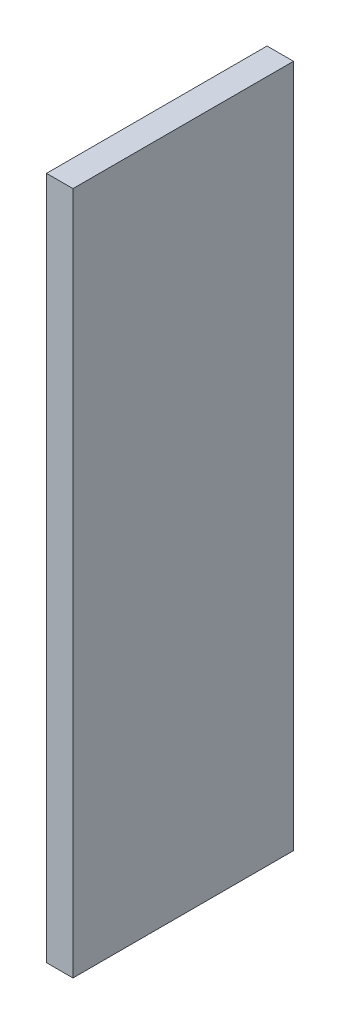
ISO-10303-21;
HEADER;
FILE_DESCRIPTION(('STEP AP214'),'2;1');
FILE_NAME('part.step','',(''),(''),'','','');
FILE_SCHEMA(('AUTOMOTIVE_DESIGN { 1 0 10303 214 1 1 1 1 }'));
ENDSEC;
DATA;
#1=APPLICATION_CONTEXT('core data for automotive mechanical design processes');
#2=APPLICATION_PROTOCOL_DEFINITION('international standard','automotive_design',2000,#1);
#3=PRODUCT_CONTEXT('',#1,'mechanical');
#4=PRODUCT('Part','Part','',(#3));
#5=PRODUCT_RELATED_PRODUCT_CATEGORY('part','',(#4));
#6=PRODUCT_DEFINITION_FORMATION('','',#4);
#7=PRODUCT_DEFINITION_CONTEXT('part definition',#1,'design');
#8=PRODUCT_DEFINITION('design','',#6,#7);
#9=PRODUCT_DEFINITION_SHAPE('','',#8);
#10=(LENGTH_UNIT() NAMED_UNIT(*) SI_UNIT(.MILLI.,.METRE.));
#11=(NAMED_UNIT(*) PLANE_ANGLE_UNIT() SI_UNIT($,.RADIAN.));
#12=(NAMED_UNIT(*) SI_UNIT($,.STERADIAN.) SOLID_ANGLE_UNIT());
#13=UNCERTAINTY_MEASURE_WITH_UNIT(LENGTH_MEASURE(1.E-05),#10,'distance_accuracy_value','');
#14=(GEOMETRIC_REPRESENTATION_CONTEXT(3) GLOBAL_UNCERTAINTY_ASSIGNED_CONTEXT((#13)) GLOBAL_UNIT_ASSIGNED_CONTEXT((#10,
#11,#12)) REPRESENTATION_CONTEXT('',''));
#15=CARTESIAN_POINT('',(0.,0.,0.));
#16=DIRECTION('',(0.,0.,1.));
#17=DIRECTION('',(1.,0.,0.));
#18=AXIS2_PLACEMENT_3D('',#15,#16,#17);
#19=CARTESIAN_POINT('',(6.,0.,0.));
#20=DIRECTION('',(0.,1.,0.));
#21=DIRECTION('',(0.,0.,1.));
#22=AXIS2_PLACEMENT_3D('',#19,#20,#21);
#23=PLANE('',#22);
#24=DIRECTION('',(0.,0.,-1.));
#25=VECTOR('',#24,1.);
#26=CARTESIAN_POINT('',(0.,0.,0.));
#27=LINE('',#26,#25);
#28=CARTESIAN_POINT('',(0.,0.,50.));
#29=VERTEX_POINT('',#28);
#30=CARTESIAN_POINT('',(0.,0.,0.));
#31=VERTEX_POINT('',#30);
#32=EDGE_CURVE('E102',#29,#31,#27,.T.);
#33=ORIENTED_EDGE('',*,*,#32,.T.);
#34=DIRECTION('',(-1.,0.,0.));
#35=VECTOR('',#34,1.);
#36=CARTESIAN_POINT('',(6.,0.,0.));
#37=LINE('',#36,#35);
#38=CARTESIAN_POINT('',(6.,0.,0.));
#39=VERTEX_POINT('',#38);
#40=EDGE_CURVE('E11',#39,#31,#37,.T.);
#41=ORIENTED_EDGE('',*,*,#40,.F.);
#42=DIRECTION('',(0.,0.,-1.));
#43=VECTOR('',#42,1.);
#44=CARTESIAN_POINT('',(6.,0.,0.));
#45=LINE('',#44,#43);
#46=CARTESIAN_POINT('',(6.,0.,50.));
#47=VERTEX_POINT('',#46);
#48=EDGE_CURVE('E90',#47,#39,#45,.T.);
#49=ORIENTED_EDGE('',*,*,#48,.F.);
#50=DIRECTION('',(-1.,0.,0.));
#51=VECTOR('',#50,1.);
#52=CARTESIAN_POINT('',(6.,0.,50.));
#53=LINE('',#52,#51);
#54=EDGE_CURVE('E98',#47,#29,#53,.T.);
#55=ORIENTED_EDGE('',*,*,#54,.T.);
#56=EDGE_LOOP('',(#33,#41,#49,#55));
#57=FACE_BOUND('',#56,.T.);
#58=ADVANCED_FACE('F39',(#57),#23,.F.);
#59=CARTESIAN_POINT('',(6.,0.,0.));
#60=DIRECTION('',(0.,0.,1.));
#61=DIRECTION('',(1.,0.,0.));
#62=AXIS2_PLACEMENT_3D('',#59,#60,#61);
#63=PLANE('',#62);
#64=DIRECTION('',(0.,1.,0.));
#65=VECTOR('',#64,1.);
#66=CARTESIAN_POINT('',(0.,0.,0.));
#67=LINE('',#66,#65);
#68=CARTESIAN_POINT('',(0.,155.,0.));
#69=VERTEX_POINT('',#68);
#70=EDGE_CURVE('E94',#31,#69,#67,.T.);
#71=ORIENTED_EDGE('',*,*,#70,.T.);
#72=DIRECTION('',(-1.,0.,0.));
#73=VECTOR('',#72,1.);
#74=CARTESIAN_POINT('',(6.,155.,0.));
#75=LINE('',#74,#73);
#76=CARTESIAN_POINT('',(6.,155.,0.));
#77=VERTEX_POINT('',#76);
#78=EDGE_CURVE('E47',#77,#69,#75,.T.);
#79=ORIENTED_EDGE('',*,*,#78,.F.);
#80=DIRECTION('',(0.,1.,0.));
#81=VECTOR('',#80,1.);
#82=CARTESIAN_POINT('',(6.,0.,0.));
#83=LINE('',#82,#81);
#84=EDGE_CURVE('E85',#39,#77,#83,.T.);
#85=ORIENTED_EDGE('',*,*,#84,.F.);
#86=ORIENTED_EDGE('',*,*,#40,.T.);
#87=EDGE_LOOP('',(#71,#79,#85,#86));
#88=FACE_BOUND('',#87,.T.);
#89=ADVANCED_FACE('F93',(#88),#63,.F.);
#90=CARTESIAN_POINT('',(6.,155.,0.));
#91=DIRECTION('',(0.,-1.,0.));
#92=DIRECTION('',(0.,0.,-1.));
#93=AXIS2_PLACEMENT_3D('',#90,#91,#92);
#94=PLANE('',#93);
#95=DIRECTION('',(0.,0.,1.));
#96=VECTOR('',#95,1.);
#97=CARTESIAN_POINT('',(0.,155.,0.));
#98=LINE('',#97,#96);
#99=CARTESIAN_POINT('',(0.,155.,50.));
#100=VERTEX_POINT('',#99);
#101=EDGE_CURVE('E72',#69,#100,#98,.T.);
#102=ORIENTED_EDGE('',*,*,#101,.T.);
#103=DIRECTION('',(-1.,0.,0.));
#104=VECTOR('',#103,1.);
#105=CARTESIAN_POINT('',(6.,155.,50.));
#106=LINE('',#105,#104);
#107=CARTESIAN_POINT('',(6.,155.,50.));
#108=VERTEX_POINT('',#107);
#109=EDGE_CURVE('E95',#108,#100,#106,.T.);
#110=ORIENTED_EDGE('',*,*,#109,.F.);
#111=DIRECTION('',(0.,0.,1.));
#112=VECTOR('',#111,1.);
#113=CARTESIAN_POINT('',(6.,155.,0.));
#114=LINE('',#113,#112);
#115=EDGE_CURVE('E88',#77,#108,#114,.T.);
#116=ORIENTED_EDGE('',*,*,#115,.F.);
#117=ORIENTED_EDGE('',*,*,#78,.T.);
#118=EDGE_LOOP('',(#102,#110,#116,#117));
#119=FACE_BOUND('',#118,.T.);
#120=ADVANCED_FACE('F96',(#119),#94,.F.);
#121=CARTESIAN_POINT('',(6.,0.,50.));
#122=DIRECTION('',(0.,0.,-1.));
#123=DIRECTION('',(-1.,0.,0.));
#124=AXIS2_PLACEMENT_3D('',#121,#122,#123);
#125=PLANE('',#124);
#126=DIRECTION('',(0.,-1.,0.));
#127=VECTOR('',#126,1.);
#128=CARTESIAN_POINT('',(0.,0.,50.));
#129=LINE('',#128,#127);
#130=EDGE_CURVE('E78',#100,#29,#129,.T.);
#131=ORIENTED_EDGE('',*,*,#130,.T.);
#132=ORIENTED_EDGE('',*,*,#54,.F.);
#133=DIRECTION('',(0.,-1.,0.));
#134=VECTOR('',#133,1.);
#135=CARTESIAN_POINT('',(6.,0.,50.));
#136=LINE('',#135,#134);
#137=EDGE_CURVE('E55',#108,#47,#136,.T.);
#138=ORIENTED_EDGE('',*,*,#137,.F.);
#139=ORIENTED_EDGE('',*,*,#109,.T.);
#140=EDGE_LOOP('',(#131,#132,#138,#139));
#141=FACE_BOUND('',#140,.T.);
#142=ADVANCED_FACE('F109',(#141),#125,.F.);
#143=CARTESIAN_POINT('',(6.,0.,0.));
#144=DIRECTION('',(-1.,0.,0.));
#145=DIRECTION('',(0.,0.,1.));
#146=AXIS2_PLACEMENT_3D('',#143,#144,#145);
#147=PLANE('',#146);
#148=ORIENTED_EDGE('',*,*,#48,.T.);
#149=ORIENTED_EDGE('',*,*,#84,.T.);
#150=ORIENTED_EDGE('',*,*,#115,.T.);
#151=ORIENTED_EDGE('',*,*,#137,.T.);
#152=EDGE_LOOP('',(#148,#149,#150,#151));
#153=FACE_BOUND('',#152,.T.);
#154=ADVANCED_FACE('F86',(#153),#147,.F.);
#155=CARTESIAN_POINT('',(0.,0.,0.));
#156=DIRECTION('',(-1.,0.,0.));
#157=DIRECTION('',(0.,0.,1.));
#158=AXIS2_PLACEMENT_3D('',#155,#156,#157);
#159=PLANE('',#158);
#160=ORIENTED_EDGE('',*,*,#32,.F.);
#161=ORIENTED_EDGE('',*,*,#130,.F.);
#162=ORIENTED_EDGE('',*,*,#101,.F.);
#163=ORIENTED_EDGE('',*,*,#70,.F.);
#164=EDGE_LOOP('',(#160,#161,#162,#163));
#165=FACE_BOUND('',#164,.T.);
#166=ADVANCED_FACE('F112',(#165),#159,.T.);
#167=CLOSED_SHELL('',(#58,#89,#120,#142,#154,#166));
#168=MANIFOLD_SOLID_BREP('B2',#167);
#169=ADVANCED_BREP_SHAPE_REPRESENTATION('',(#18,#168),#14);
#170=SHAPE_DEFINITION_REPRESENTATION(#9,#169);
ENDSEC;
END-ISO-10303-21;
